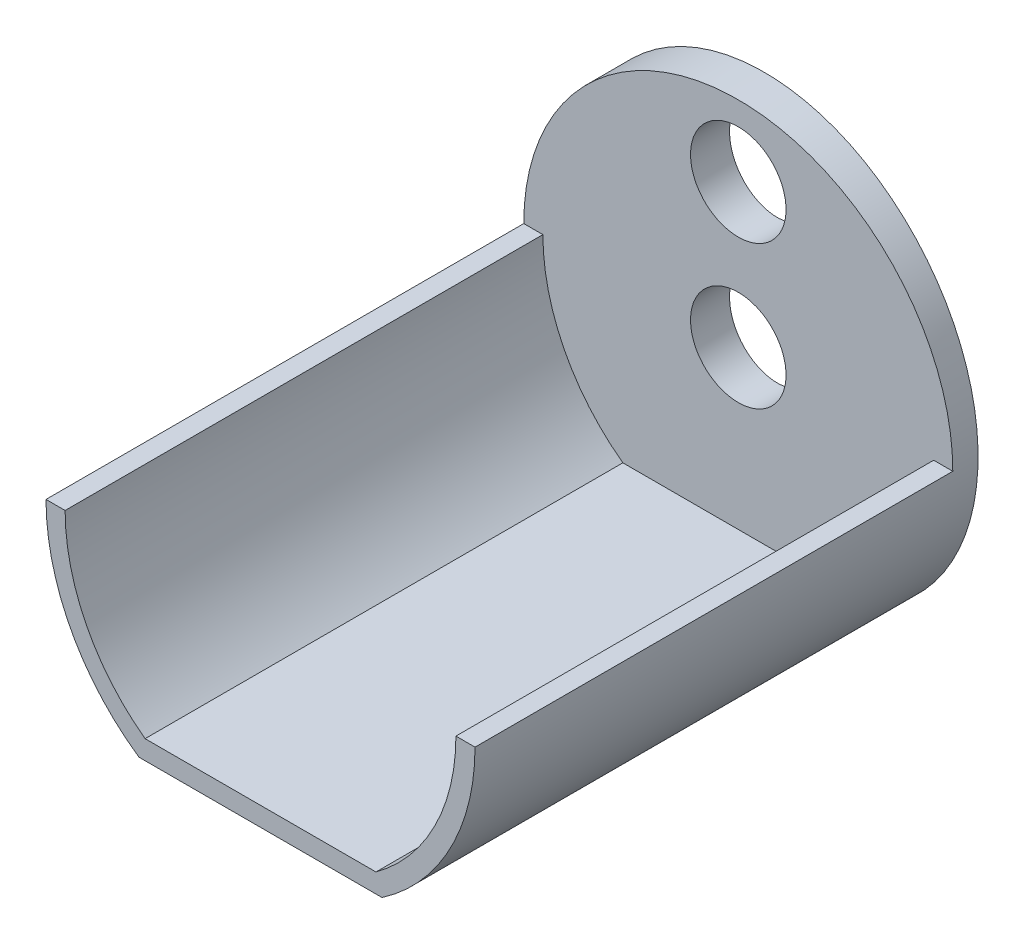
ISO-10303-21;
HEADER;
FILE_DESCRIPTION(('STEP AP214'),'2;1');
FILE_NAME('part.step','',(''),(''),'','','');
FILE_SCHEMA(('AUTOMOTIVE_DESIGN { 1 0 10303 214 1 1 1 1 }'));
ENDSEC;
DATA;
#1=APPLICATION_CONTEXT('core data for automotive mechanical design processes');
#2=APPLICATION_PROTOCOL_DEFINITION('international standard','automotive_design',2000,#1);
#3=PRODUCT_CONTEXT('',#1,'mechanical');
#4=PRODUCT('Part','Part','',(#3));
#5=PRODUCT_RELATED_PRODUCT_CATEGORY('part','',(#4));
#6=PRODUCT_DEFINITION_FORMATION('','',#4);
#7=PRODUCT_DEFINITION_CONTEXT('part definition',#1,'design');
#8=PRODUCT_DEFINITION('design','',#6,#7);
#9=PRODUCT_DEFINITION_SHAPE('','',#8);
#10=(LENGTH_UNIT() NAMED_UNIT(*) SI_UNIT(.MILLI.,.METRE.));
#11=(NAMED_UNIT(*) PLANE_ANGLE_UNIT() SI_UNIT($,.RADIAN.));
#12=(NAMED_UNIT(*) SI_UNIT($,.STERADIAN.) SOLID_ANGLE_UNIT());
#13=UNCERTAINTY_MEASURE_WITH_UNIT(LENGTH_MEASURE(1.E-05),#10,'distance_accuracy_value','');
#14=(GEOMETRIC_REPRESENTATION_CONTEXT(3) GLOBAL_UNCERTAINTY_ASSIGNED_CONTEXT((#13)) GLOBAL_UNIT_ASSIGNED_CONTEXT((#10,
#11,#12)) REPRESENTATION_CONTEXT('',''));
#15=CARTESIAN_POINT('',(0.,0.,0.));
#16=DIRECTION('',(0.,0.,1.));
#17=DIRECTION('',(1.,0.,0.));
#18=AXIS2_PLACEMENT_3D('',#15,#16,#17);
#19=CARTESIAN_POINT('',(0.,0.,5.));
#20=DIRECTION('',(0.,0.,1.));
#21=DIRECTION('',(1.,0.,0.));
#22=AXIS2_PLACEMENT_3D('',#19,#20,#21);
#23=PLANE('',#22);
#24=CARTESIAN_POINT('',(0.,0.,5.));
#25=DIRECTION('',(0.,0.,-1.));
#26=DIRECTION('',(-1.,0.,0.));
#27=AXIS2_PLACEMENT_3D('',#24,#25,#26);
#28=CIRCLE('',#27,5.);
#29=CARTESIAN_POINT('',(-5.,0.,5.));
#30=VERTEX_POINT('',#29);
#31=EDGE_CURVE('E190',#30,#30,#28,.T.);
#32=ORIENTED_EDGE('',*,*,#31,.T.);
#33=EDGE_LOOP('',(#32));
#34=FACE_BOUND('',#33,.T.);
#35=CARTESIAN_POINT('',(0.,15.,5.));
#36=DIRECTION('',(0.,0.,-1.));
#37=DIRECTION('',(-1.,0.,0.));
#38=AXIS2_PLACEMENT_3D('',#35,#36,#37);
#39=CIRCLE('',#38,5.);
#40=CARTESIAN_POINT('',(-5.,15.,5.));
#41=VERTEX_POINT('',#40);
#42=EDGE_CURVE('E186',#41,#41,#39,.T.);
#43=ORIENTED_EDGE('',*,*,#42,.T.);
#44=EDGE_LOOP('',(#43));
#45=FACE_BOUND('',#44,.T.);
#46=CARTESIAN_POINT('',(0.,0.,5.));
#47=DIRECTION('',(0.,0.,1.));
#48=DIRECTION('',(1.,0.,0.));
#49=AXIS2_PLACEMENT_3D('',#46,#47,#48);
#50=CIRCLE('',#49,22.45);
#51=CARTESIAN_POINT('',(22.45,0.,5.));
#52=VERTEX_POINT('',#51);
#53=CARTESIAN_POINT('',(-22.45,-1.56767512114057E-13,5.));
#54=VERTEX_POINT('',#53);
#55=EDGE_CURVE('E54',#52,#54,#50,.T.);
#56=ORIENTED_EDGE('',*,*,#55,.T.);
#57=DIRECTION('',(-1.,0.,0.));
#58=VECTOR('',#57,1.);
#59=CARTESIAN_POINT('',(-20.45,-1.42801586758684E-13,5.));
#60=LINE('',#59,#58);
#61=CARTESIAN_POINT('',(-20.45,-1.42801586758684E-13,5.));
#62=VERTEX_POINT('',#61);
#63=EDGE_CURVE('E61',#62,#54,#60,.T.);
#64=ORIENTED_EDGE('',*,*,#63,.F.);
#65=CARTESIAN_POINT('',(0.,0.,5.));
#66=DIRECTION('',(0.,0.,-1.));
#67=DIRECTION('',(1.,0.,0.));
#68=AXIS2_PLACEMENT_3D('',#65,#66,#67);
#69=CIRCLE('',#68,20.45);
#70=CARTESIAN_POINT('',(-12.0810802497128,-16.5,5.));
#71=VERTEX_POINT('',#70);
#72=EDGE_CURVE('E131',#71,#62,#69,.T.);
#73=ORIENTED_EDGE('',*,*,#72,.F.);
#74=DIRECTION('',(1.,0.,0.));
#75=VECTOR('',#74,1.);
#76=CARTESIAN_POINT('',(-15.2234194581901,-16.5,5.));
#77=LINE('',#76,#75);
#78=CARTESIAN_POINT('',(12.0810802497128,-16.5,5.));
#79=VERTEX_POINT('',#78);
#80=EDGE_CURVE('E135',#71,#79,#77,.T.);
#81=ORIENTED_EDGE('',*,*,#80,.T.);
#82=CARTESIAN_POINT('',(0.,0.,5.));
#83=DIRECTION('',(0.,0.,-1.));
#84=DIRECTION('',(1.,0.,0.));
#85=AXIS2_PLACEMENT_3D('',#82,#83,#84);
#86=CIRCLE('',#85,20.45);
#87=CARTESIAN_POINT('',(20.45,0.,5.));
#88=VERTEX_POINT('',#87);
#89=EDGE_CURVE('E68',#88,#79,#86,.T.);
#90=ORIENTED_EDGE('',*,*,#89,.F.);
#91=DIRECTION('',(-1.,0.,0.));
#92=VECTOR('',#91,1.);
#93=CARTESIAN_POINT('',(20.45,0.,5.));
#94=LINE('',#93,#92);
#95=EDGE_CURVE('E159',#52,#88,#94,.T.);
#96=ORIENTED_EDGE('',*,*,#95,.F.);
#97=EDGE_LOOP('',(#56,#64,#73,#81,#90,#96));
#98=FACE_BOUND('',#97,.T.);
#99=ADVANCED_FACE('F44',(#34,#45,#98),#23,.T.);
#100=CARTESIAN_POINT('',(-15.2234194581901,-16.5,55.));
#101=DIRECTION('',(0.,1.,0.));
#102=DIRECTION('',(0.,0.,1.));
#103=AXIS2_PLACEMENT_3D('',#100,#101,#102);
#104=PLANE('',#103);
#105=ORIENTED_EDGE('',*,*,#80,.F.);
#106=DIRECTION('',(0.,0.,-1.));
#107=VECTOR('',#106,1.);
#108=CARTESIAN_POINT('',(-12.0810802497128,-16.5,55.));
#109=LINE('',#108,#107);
#110=CARTESIAN_POINT('',(-12.0810802497128,-16.5,55.));
#111=VERTEX_POINT('',#110);
#112=EDGE_CURVE('E120',#111,#71,#109,.T.);
#113=ORIENTED_EDGE('',*,*,#112,.F.);
#114=DIRECTION('',(1.,0.,0.));
#115=VECTOR('',#114,1.);
#116=CARTESIAN_POINT('',(-15.2234194581901,-16.5,55.));
#117=LINE('',#116,#115);
#118=CARTESIAN_POINT('',(12.0810802497128,-16.5,55.));
#119=VERTEX_POINT('',#118);
#120=EDGE_CURVE('E126',#111,#119,#117,.T.);
#121=ORIENTED_EDGE('',*,*,#120,.T.);
#122=DIRECTION('',(0.,0.,-1.));
#123=VECTOR('',#122,1.);
#124=CARTESIAN_POINT('',(12.0810802497128,-16.5,55.));
#125=LINE('',#124,#123);
#126=EDGE_CURVE('E153',#119,#79,#125,.T.);
#127=ORIENTED_EDGE('',*,*,#126,.T.);
#128=EDGE_LOOP('',(#105,#113,#121,#127));
#129=FACE_BOUND('',#128,.T.);
#130=ADVANCED_FACE('F220',(#129),#104,.T.);
#131=CARTESIAN_POINT('',(0.,0.,5.));
#132=DIRECTION('',(0.,0.,-1.));
#133=DIRECTION('',(-1.,0.,0.));
#134=AXIS2_PLACEMENT_3D('',#131,#132,#133);
#135=CYLINDRICAL_SURFACE('',#134,22.45);
#136=ORIENTED_EDGE('',*,*,#55,.F.);
#137=DIRECTION('',(0.,0.,-1.));
#138=VECTOR('',#137,1.);
#139=CARTESIAN_POINT('',(22.45,0.,55.));
#140=LINE('',#139,#138);
#141=CARTESIAN_POINT('',(22.45,0.,55.));
#142=VERTEX_POINT('',#141);
#143=EDGE_CURVE('E144',#142,#52,#140,.T.);
#144=ORIENTED_EDGE('',*,*,#143,.F.);
#145=CARTESIAN_POINT('',(0.,0.,55.));
#146=DIRECTION('',(0.,0.,1.));
#147=DIRECTION('',(1.,0.,0.));
#148=AXIS2_PLACEMENT_3D('',#145,#146,#147);
#149=CIRCLE('',#148,22.45);
#150=CARTESIAN_POINT('',(12.7181956267389,-18.5,55.));
#151=VERTEX_POINT('',#150);
#152=EDGE_CURVE('E169',#151,#142,#149,.T.);
#153=ORIENTED_EDGE('',*,*,#152,.F.);
#154=DIRECTION('',(0.,0.,-1.));
#155=VECTOR('',#154,1.);
#156=CARTESIAN_POINT('',(12.7181956267389,-18.5,55.));
#157=LINE('',#156,#155);
#158=CARTESIAN_POINT('',(12.7181956267389,-18.5,5.));
#159=VERTEX_POINT('',#158);
#160=EDGE_CURVE('E177',#151,#159,#157,.T.);
#161=ORIENTED_EDGE('',*,*,#160,.T.);
#162=CARTESIAN_POINT('',(-12.7181956267389,-18.5,5.));
#163=VERTEX_POINT('',#162);
#164=EDGE_CURVE('E11',#163,#159,#50,.T.);
#165=ORIENTED_EDGE('',*,*,#164,.F.);
#166=DIRECTION('',(0.,0.,-1.));
#167=VECTOR('',#166,1.);
#168=CARTESIAN_POINT('',(-12.7181956267389,-18.5,55.));
#169=LINE('',#168,#167);
#170=CARTESIAN_POINT('',(-12.7181956267389,-18.5,55.));
#171=VERTEX_POINT('',#170);
#172=EDGE_CURVE('E182',#171,#163,#169,.T.);
#173=ORIENTED_EDGE('',*,*,#172,.F.);
#174=CARTESIAN_POINT('',(0.,0.,55.));
#175=DIRECTION('',(0.,0.,1.));
#176=DIRECTION('',(1.,0.,0.));
#177=AXIS2_PLACEMENT_3D('',#174,#175,#176);
#178=CIRCLE('',#177,22.45);
#179=CARTESIAN_POINT('',(-22.45,-1.56767512114057E-13,55.));
#180=VERTEX_POINT('',#179);
#181=EDGE_CURVE('E175',#180,#171,#178,.T.);
#182=ORIENTED_EDGE('',*,*,#181,.F.);
#183=DIRECTION('',(0.,0.,-1.));
#184=VECTOR('',#183,1.);
#185=CARTESIAN_POINT('',(-22.45,-1.56767512114057E-13,55.));
#186=LINE('',#185,#184);
#187=EDGE_CURVE('E117',#180,#54,#186,.T.);
#188=ORIENTED_EDGE('',*,*,#187,.T.);
#189=EDGE_LOOP('',(#136,#144,#153,#161,#165,#173,#182,#188));
#190=FACE_BOUND('',#189,.T.);
#191=CARTESIAN_POINT('',(0.,0.,1.17655464490412));
#192=DIRECTION('',(-0.0523359562429369,0.,0.998629534754574));
#193=DIRECTION('',(-0.998629534754574,0.,-0.0523359562429369));
#194=AXIS2_PLACEMENT_3D('',#191,#192,#193);
#195=ELLIPSE('',#194,22.4808091676533,22.45);
#196=CARTESIAN_POINT('',(-22.45,0.,0.));
#197=VERTEX_POINT('',#196);
#198=EDGE_CURVE('E149',#197,#197,#195,.T.);
#199=ORIENTED_EDGE('',*,*,#198,.T.);
#200=EDGE_LOOP('',(#199));
#201=FACE_BOUND('',#200,.T.);
#202=ADVANCED_FACE('F46',(#190,#201),#135,.T.);
#203=DIRECTION('',(1.,0.,0.));
#204=VECTOR('',#203,1.);
#205=CARTESIAN_POINT('',(-12.7181956267389,-18.5,5.));
#206=LINE('',#205,#204);
#207=EDGE_CURVE('E139',#163,#159,#206,.T.);
#208=ORIENTED_EDGE('',*,*,#207,.F.);
#209=ORIENTED_EDGE('',*,*,#164,.T.);
#210=EDGE_LOOP('',(#208,#209));
#211=FACE_BOUND('',#210,.T.);
#212=ADVANCED_FACE('F247',(#211),#23,.T.);
#213=CARTESIAN_POINT('',(0.,15.,5.));
#214=DIRECTION('',(0.,0.,-1.));
#215=DIRECTION('',(-1.,0.,0.));
#216=AXIS2_PLACEMENT_3D('',#213,#214,#215);
#217=CYLINDRICAL_SURFACE('',#216,5.);
#218=CARTESIAN_POINT('',(0.,15.,1.17655464490412));
#219=DIRECTION('',(-0.0523359562429369,0.,0.998629534754574));
#220=DIRECTION('',(-0.998629534754574,0.,-0.0523359562429369));
#221=AXIS2_PLACEMENT_3D('',#218,#219,#220);
#222=ELLIPSE('',#221,5.0068617299896,5.);
#223=CARTESIAN_POINT('',(-5.,15.,0.914515748488947));
#224=VERTEX_POINT('',#223);
#225=EDGE_CURVE('E228',#224,#224,#222,.F.);
#226=ORIENTED_EDGE('',*,*,#225,.T.);
#227=EDGE_LOOP('',(#226));
#228=FACE_BOUND('',#227,.T.);
#229=ORIENTED_EDGE('',*,*,#42,.F.);
#230=EDGE_LOOP('',(#229));
#231=FACE_BOUND('',#230,.T.);
#232=ADVANCED_FACE('F253',(#228,#231),#217,.F.);
#233=CARTESIAN_POINT('',(0.,0.,5.));
#234=DIRECTION('',(0.,0.,-1.));
#235=DIRECTION('',(-1.,0.,0.));
#236=AXIS2_PLACEMENT_3D('',#233,#234,#235);
#237=CYLINDRICAL_SURFACE('',#236,5.);
#238=CARTESIAN_POINT('',(0.,0.,1.17655464490412));
#239=DIRECTION('',(-0.0523359562429369,0.,0.998629534754574));
#240=DIRECTION('',(-0.998629534754574,0.,-0.0523359562429369));
#241=AXIS2_PLACEMENT_3D('',#238,#239,#240);
#242=ELLIPSE('',#241,5.0068617299896,5.);
#243=CARTESIAN_POINT('',(-5.,0.,0.914515748488947));
#244=VERTEX_POINT('',#243);
#245=EDGE_CURVE('E48',#244,#244,#242,.F.);
#246=ORIENTED_EDGE('',*,*,#245,.T.);
#247=EDGE_LOOP('',(#246));
#248=FACE_BOUND('',#247,.T.);
#249=ORIENTED_EDGE('',*,*,#31,.F.);
#250=EDGE_LOOP('',(#249));
#251=FACE_BOUND('',#250,.T.);
#252=ADVANCED_FACE('F237',(#248,#251),#237,.F.);
#253=CARTESIAN_POINT('',(-12.7181956267389,-18.5,55.));
#254=DIRECTION('',(0.,1.,0.));
#255=DIRECTION('',(0.,0.,1.));
#256=AXIS2_PLACEMENT_3D('',#253,#254,#255);
#257=PLANE('',#256);
#258=ORIENTED_EDGE('',*,*,#207,.T.);
#259=ORIENTED_EDGE('',*,*,#160,.F.);
#260=DIRECTION('',(1.,0.,0.));
#261=VECTOR('',#260,1.);
#262=CARTESIAN_POINT('',(-12.7181956267389,-18.5,55.));
#263=LINE('',#262,#261);
#264=EDGE_CURVE('E172',#171,#151,#263,.T.);
#265=ORIENTED_EDGE('',*,*,#264,.F.);
#266=ORIENTED_EDGE('',*,*,#172,.T.);
#267=EDGE_LOOP('',(#258,#259,#265,#266));
#268=FACE_BOUND('',#267,.T.);
#269=ADVANCED_FACE('F210',(#268),#257,.F.);
#270=CARTESIAN_POINT('',(0.,0.,55.));
#271=DIRECTION('',(0.,0.,1.));
#272=DIRECTION('',(1.,0.,0.));
#273=AXIS2_PLACEMENT_3D('',#270,#271,#272);
#274=PLANE('',#273);
#275=ORIENTED_EDGE('',*,*,#120,.F.);
#276=CARTESIAN_POINT('',(0.,0.,55.));
#277=DIRECTION('',(0.,0.,-1.));
#278=DIRECTION('',(1.,0.,0.));
#279=AXIS2_PLACEMENT_3D('',#276,#277,#278);
#280=CIRCLE('',#279,20.45);
#281=CARTESIAN_POINT('',(-20.45,-1.42801586758684E-13,55.));
#282=VERTEX_POINT('',#281);
#283=EDGE_CURVE('E121',#111,#282,#280,.T.);
#284=ORIENTED_EDGE('',*,*,#283,.T.);
#285=DIRECTION('',(-1.,0.,0.));
#286=VECTOR('',#285,1.);
#287=CARTESIAN_POINT('',(-20.45,-1.42801586758684E-13,55.));
#288=LINE('',#287,#286);
#289=EDGE_CURVE('E111',#282,#180,#288,.T.);
#290=ORIENTED_EDGE('',*,*,#289,.T.);
#291=ORIENTED_EDGE('',*,*,#181,.T.);
#292=ORIENTED_EDGE('',*,*,#264,.T.);
#293=ORIENTED_EDGE('',*,*,#152,.T.);
#294=DIRECTION('',(-1.,0.,0.));
#295=VECTOR('',#294,1.);
#296=CARTESIAN_POINT('',(20.45,0.,55.));
#297=LINE('',#296,#295);
#298=CARTESIAN_POINT('',(20.45,0.,55.));
#299=VERTEX_POINT('',#298);
#300=EDGE_CURVE('E160',#142,#299,#297,.T.);
#301=ORIENTED_EDGE('',*,*,#300,.T.);
#302=CARTESIAN_POINT('',(0.,0.,55.));
#303=DIRECTION('',(0.,0.,-1.));
#304=DIRECTION('',(1.,0.,0.));
#305=AXIS2_PLACEMENT_3D('',#302,#303,#304);
#306=CIRCLE('',#305,20.45);
#307=EDGE_CURVE('E156',#299,#119,#306,.T.);
#308=ORIENTED_EDGE('',*,*,#307,.T.);
#309=EDGE_LOOP('',(#275,#284,#290,#291,#292,#293,#301,#308));
#310=FACE_BOUND('',#309,.T.);
#311=ADVANCED_FACE('F124',(#310),#274,.T.);
#312=CARTESIAN_POINT('',(20.45,0.,55.));
#313=DIRECTION('',(0.,-1.,0.));
#314=DIRECTION('',(0.,0.,-1.));
#315=AXIS2_PLACEMENT_3D('',#312,#313,#314);
#316=PLANE('',#315);
#317=ORIENTED_EDGE('',*,*,#95,.T.);
#318=DIRECTION('',(0.,0.,-1.));
#319=VECTOR('',#318,1.);
#320=CARTESIAN_POINT('',(20.45,0.,55.));
#321=LINE('',#320,#319);
#322=EDGE_CURVE('E148',#299,#88,#321,.T.);
#323=ORIENTED_EDGE('',*,*,#322,.F.);
#324=ORIENTED_EDGE('',*,*,#300,.F.);
#325=ORIENTED_EDGE('',*,*,#143,.T.);
#326=EDGE_LOOP('',(#317,#323,#324,#325));
#327=FACE_BOUND('',#326,.T.);
#328=ADVANCED_FACE('F212',(#327),#316,.F.);
#329=CARTESIAN_POINT('',(0.,0.,55.));
#330=DIRECTION('',(0.,0.,-1.));
#331=DIRECTION('',(-1.,0.,0.));
#332=AXIS2_PLACEMENT_3D('',#329,#330,#331);
#333=CYLINDRICAL_SURFACE('',#332,20.45);
#334=ORIENTED_EDGE('',*,*,#89,.T.);
#335=ORIENTED_EDGE('',*,*,#126,.F.);
#336=ORIENTED_EDGE('',*,*,#307,.F.);
#337=ORIENTED_EDGE('',*,*,#322,.T.);
#338=EDGE_LOOP('',(#334,#335,#336,#337));
#339=FACE_BOUND('',#338,.T.);
#340=ADVANCED_FACE('F217',(#339),#333,.F.);
#341=CARTESIAN_POINT('',(-20.45,-1.42801586758684E-13,55.));
#342=DIRECTION('',(0.,-1.,0.));
#343=DIRECTION('',(1.,0.,0.));
#344=AXIS2_PLACEMENT_3D('',#341,#342,#343);
#345=PLANE('',#344);
#346=ORIENTED_EDGE('',*,*,#63,.T.);
#347=ORIENTED_EDGE('',*,*,#187,.F.);
#348=ORIENTED_EDGE('',*,*,#289,.F.);
#349=DIRECTION('',(0.,0.,-1.));
#350=VECTOR('',#349,1.);
#351=CARTESIAN_POINT('',(-20.45,-1.42801586758684E-13,55.));
#352=LINE('',#351,#350);
#353=EDGE_CURVE('E115',#282,#62,#352,.T.);
#354=ORIENTED_EDGE('',*,*,#353,.T.);
#355=EDGE_LOOP('',(#346,#347,#348,#354));
#356=FACE_BOUND('',#355,.T.);
#357=ADVANCED_FACE('F113',(#356),#345,.F.);
#358=CARTESIAN_POINT('',(0.,0.,55.));
#359=DIRECTION('',(0.,0.,-1.));
#360=DIRECTION('',(-1.,0.,0.));
#361=AXIS2_PLACEMENT_3D('',#358,#359,#360);
#362=CYLINDRICAL_SURFACE('',#361,20.45);
#363=ORIENTED_EDGE('',*,*,#72,.T.);
#364=ORIENTED_EDGE('',*,*,#353,.F.);
#365=ORIENTED_EDGE('',*,*,#283,.F.);
#366=ORIENTED_EDGE('',*,*,#112,.T.);
#367=EDGE_LOOP('',(#363,#364,#365,#366));
#368=FACE_BOUND('',#367,.T.);
#369=ADVANCED_FACE('F133',(#368),#362,.F.);
#370=CARTESIAN_POINT('',(22.45,-22.45,2.35310928980824));
#371=DIRECTION('',(-0.0523359562429369,0.,0.998629534754574));
#372=DIRECTION('',(0.998629534754574,0.,0.0523359562429369));
#373=AXIS2_PLACEMENT_3D('',#370,#371,#372);
#374=PLANE('',#373);
#375=ORIENTED_EDGE('',*,*,#245,.F.);
#376=EDGE_LOOP('',(#375));
#377=FACE_BOUND('',#376,.T.);
#378=ORIENTED_EDGE('',*,*,#225,.F.);
#379=EDGE_LOOP('',(#378));
#380=FACE_BOUND('',#379,.T.);
#381=ORIENTED_EDGE('',*,*,#198,.F.);
#382=EDGE_LOOP('',(#381));
#383=FACE_BOUND('',#382,.T.);
#384=ADVANCED_FACE('F240',(#377,#380,#383),#374,.F.);
#385=CLOSED_SHELL('',(#99,#130,#202,#212,#232,#252,#269,#311,#328,#340,#357,#369,#384));
#386=MANIFOLD_SOLID_BREP('B2',#385);
#387=ADVANCED_BREP_SHAPE_REPRESENTATION('',(#18,#386),#14);
#388=SHAPE_DEFINITION_REPRESENTATION(#9,#387);
ENDSEC;
END-ISO-10303-21;
